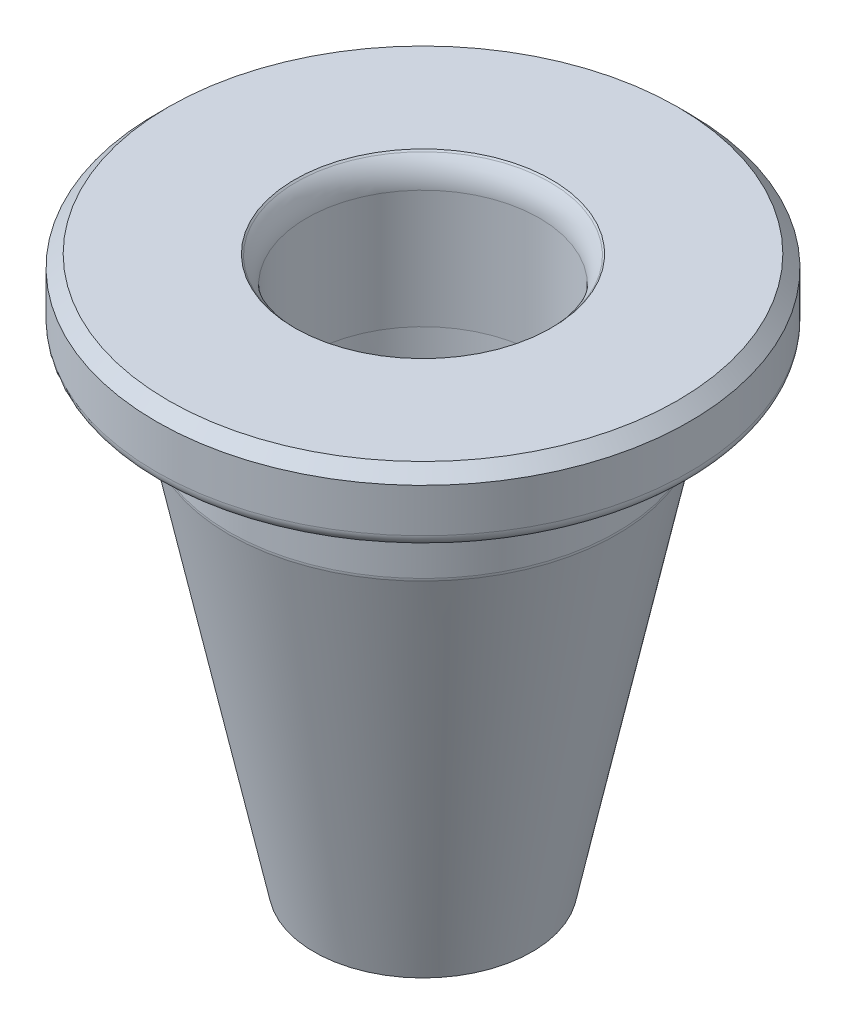
ISO-10303-21;
HEADER;
FILE_DESCRIPTION(('STEP AP214'),'2;1');
FILE_NAME('part.step','',(''),(''),'','','');
FILE_SCHEMA(('AUTOMOTIVE_DESIGN { 1 0 10303 214 1 1 1 1 }'));
ENDSEC;
DATA;
#1=APPLICATION_CONTEXT('core data for automotive mechanical design processes');
#2=APPLICATION_PROTOCOL_DEFINITION('international standard','automotive_design',2000,#1);
#3=PRODUCT_CONTEXT('',#1,'mechanical');
#4=PRODUCT('Part','Part','',(#3));
#5=PRODUCT_RELATED_PRODUCT_CATEGORY('part','',(#4));
#6=PRODUCT_DEFINITION_FORMATION('','',#4);
#7=PRODUCT_DEFINITION_CONTEXT('part definition',#1,'design');
#8=PRODUCT_DEFINITION('design','',#6,#7);
#9=PRODUCT_DEFINITION_SHAPE('','',#8);
#10=(LENGTH_UNIT() NAMED_UNIT(*) SI_UNIT(.MILLI.,.METRE.));
#11=(NAMED_UNIT(*) PLANE_ANGLE_UNIT() SI_UNIT($,.RADIAN.));
#12=(NAMED_UNIT(*) SI_UNIT($,.STERADIAN.) SOLID_ANGLE_UNIT());
#13=UNCERTAINTY_MEASURE_WITH_UNIT(LENGTH_MEASURE(1.E-05),#10,'distance_accuracy_value','');
#14=(GEOMETRIC_REPRESENTATION_CONTEXT(3) GLOBAL_UNCERTAINTY_ASSIGNED_CONTEXT((#13)) GLOBAL_UNIT_ASSIGNED_CONTEXT((#10,
#11,#12)) REPRESENTATION_CONTEXT('',''));
#15=CARTESIAN_POINT('',(0.,0.,0.));
#16=DIRECTION('',(0.,0.,1.));
#17=DIRECTION('',(1.,0.,0.));
#18=AXIS2_PLACEMENT_3D('',#15,#16,#17);
#19=CARTESIAN_POINT('',(0.,0.,0.));
#20=DIRECTION('',(0.,-1.,0.));
#21=DIRECTION('',(0.,0.,-1.));
#22=AXIS2_PLACEMENT_3D('',#19,#20,#21);
#23=CYLINDRICAL_SURFACE('',#22,8.);
#24=CARTESIAN_POINT('',(0.,17.0518321554969,0.));
#25=DIRECTION('',(0.,1.,0.));
#26=DIRECTION('',(0.,0.,1.));
#27=AXIS2_PLACEMENT_3D('',#24,#25,#26);
#28=CIRCLE('',#27,8.);
#29=CARTESIAN_POINT('',(0.,17.0518321554969,8.));
#30=VERTEX_POINT('',#29);
#31=EDGE_CURVE('E74',#30,#30,#28,.T.);
#32=ORIENTED_EDGE('',*,*,#31,.T.);
#33=EDGE_LOOP('',(#32));
#34=FACE_BOUND('',#33,.T.);
#35=CARTESIAN_POINT('',(0.,19.7,0.));
#36=DIRECTION('',(0.,1.,0.));
#37=DIRECTION('',(0.,0.,1.));
#38=AXIS2_PLACEMENT_3D('',#35,#36,#37);
#39=CIRCLE('',#38,8.);
#40=CARTESIAN_POINT('',(0.,19.7,8.));
#41=VERTEX_POINT('',#40);
#42=EDGE_CURVE('E77',#41,#41,#39,.F.);
#43=ORIENTED_EDGE('',*,*,#42,.T.);
#44=EDGE_LOOP('',(#43));
#45=FACE_BOUND('',#44,.T.);
#46=ADVANCED_FACE('F42',(#34,#45),#23,.T.);
#47=CARTESIAN_POINT('',(0.,0.,0.));
#48=DIRECTION('',(0.,1.,0.));
#49=DIRECTION('',(0.,0.,1.));
#50=AXIS2_PLACEMENT_3D('',#47,#48,#49);
#51=CONICAL_SURFACE('',#50,4.,1.03037682652431);
#52=CARTESIAN_POINT('',(0.,0.3,0.));
#53=DIRECTION('',(0.,-1.,0.));
#54=DIRECTION('',(0.,0.,-1.));
#55=AXIS2_PLACEMENT_3D('',#52,#53,#54);
#56=CIRCLE('',#55,4.5);
#57=CARTESIAN_POINT('',(0.,0.3,-4.5));
#58=VERTEX_POINT('',#57);
#59=EDGE_CURVE('E89',#58,#58,#56,.T.);
#60=ORIENTED_EDGE('',*,*,#59,.T.);
#61=EDGE_LOOP('',(#60));
#62=FACE_BOUND('',#61,.T.);
#63=CARTESIAN_POINT('',(0.,0.,0.));
#64=DIRECTION('',(0.,-1.,0.));
#65=DIRECTION('',(0.,0.,-1.));
#66=AXIS2_PLACEMENT_3D('',#63,#64,#65);
#67=CIRCLE('',#66,4.);
#68=CARTESIAN_POINT('',(0.,0.,-4.));
#69=VERTEX_POINT('',#68);
#70=EDGE_CURVE('E83',#69,#69,#67,.T.);
#71=ORIENTED_EDGE('',*,*,#70,.F.);
#72=EDGE_LOOP('',(#71));
#73=FACE_BOUND('',#72,.T.);
#74=ADVANCED_FACE('F93',(#62,#73),#51,.T.);
#75=CARTESIAN_POINT('',(0.,17.,0.));
#76=DIRECTION('',(0.,1.,0.));
#77=DIRECTION('',(0.,0.,1.));
#78=AXIS2_PLACEMENT_3D('',#75,#76,#77);
#79=CONICAL_SURFACE('',#78,4.8,0.0470241318427461);
#80=ORIENTED_EDGE('',*,*,#70,.T.);
#81=EDGE_LOOP('',(#80));
#82=FACE_BOUND('',#81,.T.);
#83=CARTESIAN_POINT('',(0.,17.,0.));
#84=DIRECTION('',(0.,-1.,0.));
#85=DIRECTION('',(0.,0.,-1.));
#86=AXIS2_PLACEMENT_3D('',#83,#84,#85);
#87=CIRCLE('',#86,4.8);
#88=CARTESIAN_POINT('',(0.,17.,-4.8));
#89=VERTEX_POINT('',#88);
#90=EDGE_CURVE('E86',#89,#89,#87,.T.);
#91=ORIENTED_EDGE('',*,*,#90,.F.);
#92=EDGE_LOOP('',(#91));
#93=FACE_BOUND('',#92,.T.);
#94=ADVANCED_FACE('F120',(#82,#93),#79,.F.);
#95=CARTESIAN_POINT('',(0.,0.,0.));
#96=DIRECTION('',(0.,-1.,0.));
#97=DIRECTION('',(0.,0.,-1.));
#98=AXIS2_PLACEMENT_3D('',#95,#96,#97);
#99=CYLINDRICAL_SURFACE('',#98,4.8);
#100=CARTESIAN_POINT('',(0.,21.8786796564404,0.));
#101=DIRECTION('',(0.,-1.,0.));
#102=DIRECTION('',(0.,0.,-1.));
#103=AXIS2_PLACEMENT_3D('',#100,#101,#102);
#104=CIRCLE('',#103,4.8);
#105=CARTESIAN_POINT('',(0.,21.8786796564404,-4.8));
#106=VERTEX_POINT('',#105);
#107=EDGE_CURVE('E49',#106,#106,#104,.F.);
#108=ORIENTED_EDGE('',*,*,#107,.T.);
#109=EDGE_LOOP('',(#108));
#110=FACE_BOUND('',#109,.T.);
#111=ORIENTED_EDGE('',*,*,#90,.T.);
#112=EDGE_LOOP('',(#111));
#113=FACE_BOUND('',#112,.T.);
#114=ADVANCED_FACE('F111',(#110,#113),#99,.F.);
#115=CARTESIAN_POINT('',(4.8,23.,0.));
#116=DIRECTION('',(0.,1.,0.));
#117=DIRECTION('',(0.,0.,1.));
#118=AXIS2_PLACEMENT_3D('',#115,#116,#117);
#119=PLANE('',#118);
#120=CARTESIAN_POINT('',(0.,23.,0.));
#121=DIRECTION('',(0.,1.,0.));
#122=DIRECTION('',(0.,0.,1.));
#123=AXIS2_PLACEMENT_3D('',#120,#121,#122);
#124=CIRCLE('',#123,10.5);
#125=CARTESIAN_POINT('',(0.,23.,10.5));
#126=VERTEX_POINT('',#125);
#127=EDGE_CURVE('E57',#126,#126,#124,.T.);
#128=ORIENTED_EDGE('',*,*,#127,.T.);
#129=EDGE_LOOP('',(#128));
#130=FACE_BOUND('',#129,.T.);
#131=CARTESIAN_POINT('',(0.,23.,0.));
#132=DIRECTION('',(0.,1.,0.));
#133=DIRECTION('',(0.,0.,1.));
#134=AXIS2_PLACEMENT_3D('',#131,#132,#133);
#135=CIRCLE('',#134,5.3);
#136=CARTESIAN_POINT('',(0.,23.,5.3));
#137=VERTEX_POINT('',#136);
#138=EDGE_CURVE('E62',#137,#137,#135,.F.);
#139=ORIENTED_EDGE('',*,*,#138,.T.);
#140=EDGE_LOOP('',(#139));
#141=FACE_BOUND('',#140,.T.);
#142=ADVANCED_FACE('F99',(#130,#141),#119,.T.);
#143=CARTESIAN_POINT('',(0.,0.3,0.));
#144=DIRECTION('',(0.,1.,0.));
#145=DIRECTION('',(0.,0.,1.));
#146=AXIS2_PLACEMENT_3D('',#143,#144,#145);
#147=CONICAL_SURFACE('',#146,4.5,0.206590702988168);
#148=CARTESIAN_POINT('',(0.,16.9492700070293,0.));
#149=DIRECTION('',(0.,-1.,0.));
#150=DIRECTION('',(0.,0.,-1.));
#151=AXIS2_PLACEMENT_3D('',#148,#149,#150);
#152=CIRCLE('',#151,7.98936796554507);
#153=CARTESIAN_POINT('',(0.,16.9492700070293,-7.98936796554507));
#154=VERTEX_POINT('',#153);
#155=EDGE_CURVE('E80',#154,#154,#152,.T.);
#156=ORIENTED_EDGE('',*,*,#155,.T.);
#157=EDGE_LOOP('',(#156));
#158=FACE_BOUND('',#157,.T.);
#159=ORIENTED_EDGE('',*,*,#59,.F.);
#160=EDGE_LOOP('',(#159));
#161=FACE_BOUND('',#160,.T.);
#162=ADVANCED_FACE('F96',(#158,#161),#147,.T.);
#163=CARTESIAN_POINT('',(0.,20.2,0.));
#164=DIRECTION('',(0.,1.,0.));
#165=DIRECTION('',(0.,0.,1.));
#166=AXIS2_PLACEMENT_3D('',#163,#164,#165);
#167=CYLINDRICAL_SURFACE('',#166,11.);
#168=CARTESIAN_POINT('',(0.,22.5,0.));
#169=DIRECTION('',(0.,1.,0.));
#170=DIRECTION('',(0.,0.,1.));
#171=AXIS2_PLACEMENT_3D('',#168,#169,#170);
#172=CIRCLE('',#171,11.);
#173=CARTESIAN_POINT('',(0.,22.5,11.));
#174=VERTEX_POINT('',#173);
#175=EDGE_CURVE('E53',#174,#174,#172,.F.);
#176=ORIENTED_EDGE('',*,*,#175,.T.);
#177=EDGE_LOOP('',(#176));
#178=FACE_BOUND('',#177,.T.);
#179=CARTESIAN_POINT('',(0.,20.7,0.));
#180=DIRECTION('',(0.,1.,0.));
#181=DIRECTION('',(0.,0.,1.));
#182=AXIS2_PLACEMENT_3D('',#179,#180,#181);
#183=CIRCLE('',#182,11.);
#184=CARTESIAN_POINT('',(0.,20.7,11.));
#185=VERTEX_POINT('',#184);
#186=EDGE_CURVE('E71',#185,#185,#183,.T.);
#187=ORIENTED_EDGE('',*,*,#186,.T.);
#188=EDGE_LOOP('',(#187));
#189=FACE_BOUND('',#188,.T.);
#190=ADVANCED_FACE('F98',(#178,#189),#167,.T.);
#191=CARTESIAN_POINT('',(0.,20.2,0.));
#192=DIRECTION('',(0.,1.,0.));
#193=DIRECTION('',(0.,0.,1.));
#194=AXIS2_PLACEMENT_3D('',#191,#192,#193);
#195=PLANE('',#194);
#196=CARTESIAN_POINT('',(0.,20.2,0.));
#197=DIRECTION('',(0.,1.,0.));
#198=DIRECTION('',(0.,0.,1.));
#199=AXIS2_PLACEMENT_3D('',#196,#197,#198);
#200=CIRCLE('',#199,10.5);
#201=CARTESIAN_POINT('',(0.,20.2,10.5));
#202=VERTEX_POINT('',#201);
#203=EDGE_CURVE('E65',#202,#202,#200,.F.);
#204=ORIENTED_EDGE('',*,*,#203,.T.);
#205=EDGE_LOOP('',(#204));
#206=FACE_BOUND('',#205,.T.);
#207=CARTESIAN_POINT('',(0.,20.2,0.));
#208=DIRECTION('',(0.,1.,0.));
#209=DIRECTION('',(0.,0.,1.));
#210=AXIS2_PLACEMENT_3D('',#207,#208,#209);
#211=CIRCLE('',#210,8.5);
#212=CARTESIAN_POINT('',(0.,20.2,8.5));
#213=VERTEX_POINT('',#212);
#214=EDGE_CURVE('E68',#213,#213,#211,.T.);
#215=ORIENTED_EDGE('',*,*,#214,.T.);
#216=EDGE_LOOP('',(#215));
#217=FACE_BOUND('',#216,.T.);
#218=ADVANCED_FACE('F107',(#206,#217),#195,.F.);
#219=CARTESIAN_POINT('',(0.,17.0518321554969,0.));
#220=DIRECTION('',(0.,1.,0.));
#221=DIRECTION('',(0.,0.,1.));
#222=AXIS2_PLACEMENT_3D('',#219,#220,#221);
#223=TOROIDAL_SURFACE('',#222,7.5,0.5);
#224=ORIENTED_EDGE('',*,*,#31,.F.);
#225=EDGE_LOOP('',(#224));
#226=FACE_BOUND('',#225,.T.);
#227=ORIENTED_EDGE('',*,*,#155,.F.);
#228=EDGE_LOOP('',(#227));
#229=FACE_BOUND('',#228,.T.);
#230=ADVANCED_FACE('F128',(#226,#229),#223,.T.);
#231=CARTESIAN_POINT('',(0.,20.7,0.));
#232=DIRECTION('',(0.,1.,0.));
#233=DIRECTION('',(0.,0.,1.));
#234=AXIS2_PLACEMENT_3D('',#231,#232,#233);
#235=TOROIDAL_SURFACE('',#234,10.5,0.5);
#236=ORIENTED_EDGE('',*,*,#203,.F.);
#237=EDGE_LOOP('',(#236));
#238=FACE_BOUND('',#237,.T.);
#239=ORIENTED_EDGE('',*,*,#186,.F.);
#240=EDGE_LOOP('',(#239));
#241=FACE_BOUND('',#240,.T.);
#242=ADVANCED_FACE('F131',(#238,#241),#235,.T.);
#243=CARTESIAN_POINT('',(0.,19.7,0.));
#244=DIRECTION('',(0.,1.,0.));
#245=DIRECTION('',(0.,0.,1.));
#246=AXIS2_PLACEMENT_3D('',#243,#244,#245);
#247=TOROIDAL_SURFACE('',#246,8.5,0.5);
#248=ORIENTED_EDGE('',*,*,#214,.F.);
#249=EDGE_LOOP('',(#248));
#250=FACE_BOUND('',#249,.T.);
#251=ORIENTED_EDGE('',*,*,#42,.F.);
#252=EDGE_LOOP('',(#251));
#253=FACE_BOUND('',#252,.T.);
#254=ADVANCED_FACE('F135',(#250,#253),#247,.F.);
#255=CARTESIAN_POINT('',(0.,23.,0.));
#256=DIRECTION('',(0.,-1.,0.));
#257=DIRECTION('',(0.,0.,-1.));
#258=AXIS2_PLACEMENT_3D('',#255,#256,#257);
#259=CONICAL_SURFACE('',#258,10.5,0.785398163397452);
#260=ORIENTED_EDGE('',*,*,#175,.F.);
#261=EDGE_LOOP('',(#260));
#262=FACE_BOUND('',#261,.T.);
#263=ORIENTED_EDGE('',*,*,#127,.F.);
#264=EDGE_LOOP('',(#263));
#265=FACE_BOUND('',#264,.T.);
#266=ADVANCED_FACE('F139',(#262,#265),#259,.T.);
#267=CARTESIAN_POINT('',(0.,23.,0.));
#268=DIRECTION('',(0.,1.,0.));
#269=DIRECTION('',(0.,0.,1.));
#270=AXIS2_PLACEMENT_3D('',#267,#268,#269);
#271=CONICAL_SURFACE('',#270,5.3,0.785398163397448);
#272=CARTESIAN_POINT('',(0.,22.9393398282202,0.));
#273=DIRECTION('',(0.,-1.,0.));
#274=DIRECTION('',(0.,0.,-1.));
#275=AXIS2_PLACEMENT_3D('',#272,#273,#274);
#276=CIRCLE('',#275,5.23933982822018);
#277=CARTESIAN_POINT('',(0.,22.9393398282202,-5.23933982822018));
#278=VERTEX_POINT('',#277);
#279=EDGE_CURVE('E11',#278,#278,#276,.T.);
#280=ORIENTED_EDGE('',*,*,#279,.T.);
#281=EDGE_LOOP('',(#280));
#282=FACE_BOUND('',#281,.T.);
#283=ORIENTED_EDGE('',*,*,#138,.F.);
#284=EDGE_LOOP('',(#283));
#285=FACE_BOUND('',#284,.T.);
#286=ADVANCED_FACE('F146',(#282,#285),#271,.F.);
#287=CARTESIAN_POINT('',(0.,21.8786796564404,0.));
#288=DIRECTION('',(0.,-1.,0.));
#289=DIRECTION('',(0.,0.,-1.));
#290=AXIS2_PLACEMENT_3D('',#287,#288,#289);
#291=TOROIDAL_SURFACE('',#290,6.3,1.5);
#292=ORIENTED_EDGE('',*,*,#279,.F.);
#293=EDGE_LOOP('',(#292));
#294=FACE_BOUND('',#293,.T.);
#295=ORIENTED_EDGE('',*,*,#107,.F.);
#296=EDGE_LOOP('',(#295));
#297=FACE_BOUND('',#296,.T.);
#298=ADVANCED_FACE('F44',(#294,#297),#291,.T.);
#299=CLOSED_SHELL('',(#46,#74,#94,#114,#142,#162,#190,#218,#230,#242,#254,#266,#286,#298));
#300=MANIFOLD_SOLID_BREP('B2',#299);
#301=ADVANCED_BREP_SHAPE_REPRESENTATION('',(#18,#300),#14);
#302=SHAPE_DEFINITION_REPRESENTATION(#9,#301);
ENDSEC;
END-ISO-10303-21;
